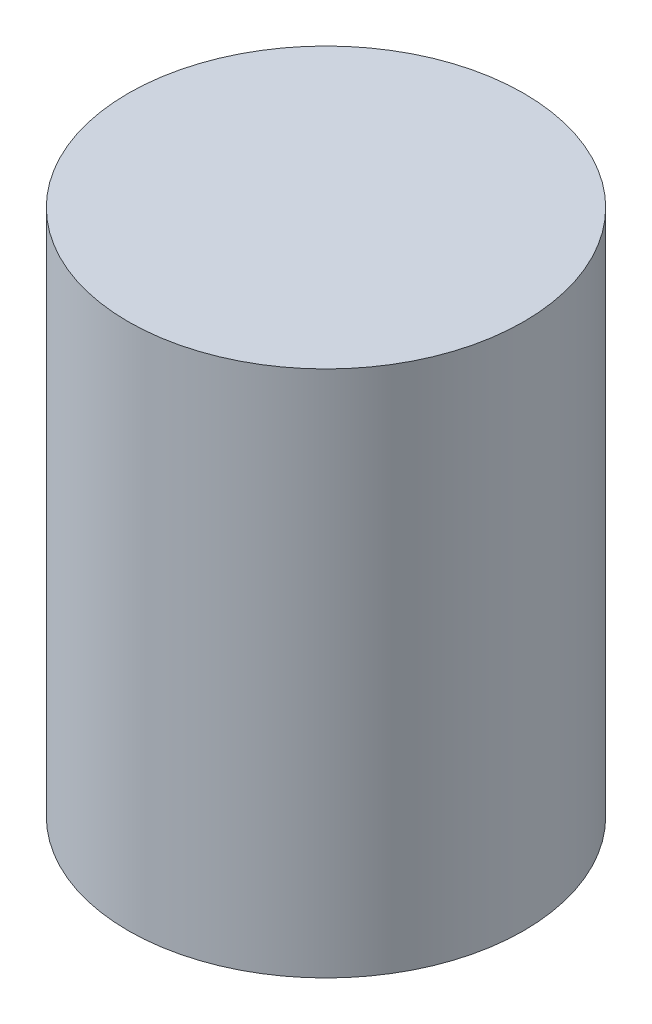
ISO-10303-21;
HEADER;
FILE_DESCRIPTION(('STEP AP214'),'2;1');
FILE_NAME('part.step','',(''),(''),'','','');
FILE_SCHEMA(('AUTOMOTIVE_DESIGN { 1 0 10303 214 1 1 1 1 }'));
ENDSEC;
DATA;
#1=APPLICATION_CONTEXT('core data for automotive mechanical design processes');
#2=APPLICATION_PROTOCOL_DEFINITION('international standard','automotive_design',2000,#1);
#3=PRODUCT_CONTEXT('',#1,'mechanical');
#4=PRODUCT('Part','Part','',(#3));
#5=PRODUCT_RELATED_PRODUCT_CATEGORY('part','',(#4));
#6=PRODUCT_DEFINITION_FORMATION('','',#4);
#7=PRODUCT_DEFINITION_CONTEXT('part definition',#1,'design');
#8=PRODUCT_DEFINITION('design','',#6,#7);
#9=PRODUCT_DEFINITION_SHAPE('','',#8);
#10=(LENGTH_UNIT() NAMED_UNIT(*) SI_UNIT(.MILLI.,.METRE.));
#11=(NAMED_UNIT(*) PLANE_ANGLE_UNIT() SI_UNIT($,.RADIAN.));
#12=(NAMED_UNIT(*) SI_UNIT($,.STERADIAN.) SOLID_ANGLE_UNIT());
#13=UNCERTAINTY_MEASURE_WITH_UNIT(LENGTH_MEASURE(1.E-05),#10,'distance_accuracy_value','');
#14=(GEOMETRIC_REPRESENTATION_CONTEXT(3) GLOBAL_UNCERTAINTY_ASSIGNED_CONTEXT((#13)) GLOBAL_UNIT_ASSIGNED_CONTEXT((#10,
#11,#12)) REPRESENTATION_CONTEXT('',''));
#15=CARTESIAN_POINT('',(0.,0.,0.));
#16=DIRECTION('',(0.,0.,1.));
#17=DIRECTION('',(1.,0.,0.));
#18=AXIS2_PLACEMENT_3D('',#15,#16,#17);
#19=CARTESIAN_POINT('',(0.,240.,0.));
#20=DIRECTION('',(0.,-1.,0.));
#21=DIRECTION('',(0.,0.,-1.));
#22=AXIS2_PLACEMENT_3D('',#19,#20,#21);
#23=CYLINDRICAL_SURFACE('',#22,90.);
#24=CARTESIAN_POINT('',(0.,240.,0.));
#25=DIRECTION('',(0.,1.,0.));
#26=DIRECTION('',(0.,0.,1.));
#27=AXIS2_PLACEMENT_3D('',#24,#25,#26);
#28=CIRCLE('',#27,90.);
#29=CARTESIAN_POINT('',(0.,240.,90.));
#30=VERTEX_POINT('',#29);
#31=EDGE_CURVE('E58',#30,#30,#28,.T.);
#32=ORIENTED_EDGE('',*,*,#31,.F.);
#33=EDGE_LOOP('',(#32));
#34=FACE_BOUND('',#33,.T.);
#35=CARTESIAN_POINT('',(0.,0.,0.));
#36=DIRECTION('',(0.,1.,0.));
#37=DIRECTION('',(0.,0.,1.));
#38=AXIS2_PLACEMENT_3D('',#35,#36,#37);
#39=CIRCLE('',#38,90.);
#40=CARTESIAN_POINT('',(0.,0.,90.));
#41=VERTEX_POINT('',#40);
#42=EDGE_CURVE('E60',#41,#41,#39,.T.);
#43=ORIENTED_EDGE('',*,*,#42,.T.);
#44=EDGE_LOOP('',(#43));
#45=FACE_BOUND('',#44,.T.);
#46=ADVANCED_FACE('F44',(#34,#45),#23,.T.);
#47=CARTESIAN_POINT('',(0.,240.,0.));
#48=DIRECTION('',(0.,1.,0.));
#49=DIRECTION('',(0.,0.,1.));
#50=AXIS2_PLACEMENT_3D('',#47,#48,#49);
#51=PLANE('',#50);
#52=ORIENTED_EDGE('',*,*,#31,.T.);
#53=EDGE_LOOP('',(#52));
#54=FACE_BOUND('',#53,.T.);
#55=ADVANCED_FACE('F68',(#54),#51,.T.);
#56=CARTESIAN_POINT('',(0.,0.,0.));
#57=DIRECTION('',(0.,1.,0.));
#58=DIRECTION('',(0.,0.,1.));
#59=AXIS2_PLACEMENT_3D('',#56,#57,#58);
#60=PLANE('',#59);
#61=ORIENTED_EDGE('',*,*,#42,.F.);
#62=EDGE_LOOP('',(#61));
#63=FACE_BOUND('',#62,.T.);
#64=ADVANCED_FACE('F75',(#63),#60,.F.);
#65=CLOSED_SHELL('',(#46,#55,#64));
#66=CARTESIAN_POINT('',(0.,240.,0.));
#67=DIRECTION('',(0.,-1.,0.));
#68=DIRECTION('',(0.,0.,-1.));
#69=AXIS2_PLACEMENT_3D('',#66,#67,#68);
#70=CYLINDRICAL_SURFACE('',#69,78.);
#71=CARTESIAN_POINT('',(0.,228.,0.));
#72=DIRECTION('',(0.,1.,0.));
#73=DIRECTION('',(0.,0.,1.));
#74=AXIS2_PLACEMENT_3D('',#71,#72,#73);
#75=CIRCLE('',#74,78.);
#76=CARTESIAN_POINT('',(0.,228.,78.));
#77=VERTEX_POINT('',#76);
#78=EDGE_CURVE('E10',#77,#77,#75,.T.);
#79=ORIENTED_EDGE('',*,*,#78,.T.);
#80=EDGE_LOOP('',(#79));
#81=FACE_BOUND('',#80,.T.);
#82=CARTESIAN_POINT('',(0.,12.,0.));
#83=DIRECTION('',(0.,1.,0.));
#84=DIRECTION('',(0.,0.,1.));
#85=AXIS2_PLACEMENT_3D('',#82,#83,#84);
#86=CIRCLE('',#85,78.);
#87=CARTESIAN_POINT('',(0.,12.,78.));
#88=VERTEX_POINT('',#87);
#89=EDGE_CURVE('E48',#88,#88,#86,.T.);
#90=ORIENTED_EDGE('',*,*,#89,.F.);
#91=EDGE_LOOP('',(#90));
#92=FACE_BOUND('',#91,.T.);
#93=ADVANCED_FACE('F84',(#81,#92),#70,.F.);
#94=CARTESIAN_POINT('',(0.,228.,0.));
#95=DIRECTION('',(0.,1.,0.));
#96=DIRECTION('',(0.,0.,1.));
#97=AXIS2_PLACEMENT_3D('',#94,#95,#96);
#98=PLANE('',#97);
#99=ORIENTED_EDGE('',*,*,#78,.F.);
#100=EDGE_LOOP('',(#99));
#101=FACE_BOUND('',#100,.T.);
#102=ADVANCED_FACE('F85',(#101),#98,.F.);
#103=CARTESIAN_POINT('',(0.,12.,0.));
#104=DIRECTION('',(0.,1.,0.));
#105=DIRECTION('',(0.,0.,1.));
#106=AXIS2_PLACEMENT_3D('',#103,#104,#105);
#107=PLANE('',#106);
#108=ORIENTED_EDGE('',*,*,#89,.T.);
#109=EDGE_LOOP('',(#108));
#110=FACE_BOUND('',#109,.T.);
#111=ADVANCED_FACE('F46',(#110),#107,.T.);
#112=CLOSED_SHELL('',(#93,#102,#111));
#113=ORIENTED_CLOSED_SHELL('',*,#112,.T.);
#114=BREP_WITH_VOIDS('B2',#65,(#113));
#115=ADVANCED_BREP_SHAPE_REPRESENTATION('',(#18,#114),#14);
#116=SHAPE_DEFINITION_REPRESENTATION(#9,#115);
ENDSEC;
END-ISO-10303-21;
